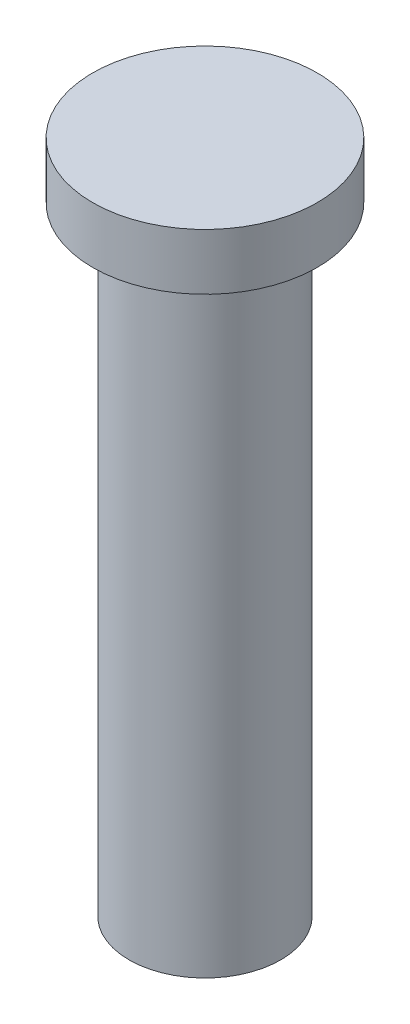
ISO-10303-21;
HEADER;
FILE_DESCRIPTION(('STEP AP214'),'2;1');
FILE_NAME('part.step','',(''),(''),'','','');
FILE_SCHEMA(('AUTOMOTIVE_DESIGN { 1 0 10303 214 1 1 1 1 }'));
ENDSEC;
DATA;
#1=APPLICATION_CONTEXT('core data for automotive mechanical design processes');
#2=APPLICATION_PROTOCOL_DEFINITION('international standard','automotive_design',2000,#1);
#3=PRODUCT_CONTEXT('',#1,'mechanical');
#4=PRODUCT('Part','Part','',(#3));
#5=PRODUCT_RELATED_PRODUCT_CATEGORY('part','',(#4));
#6=PRODUCT_DEFINITION_FORMATION('','',#4);
#7=PRODUCT_DEFINITION_CONTEXT('part definition',#1,'design');
#8=PRODUCT_DEFINITION('design','',#6,#7);
#9=PRODUCT_DEFINITION_SHAPE('','',#8);
#10=(LENGTH_UNIT() NAMED_UNIT(*) SI_UNIT(.MILLI.,.METRE.));
#11=(NAMED_UNIT(*) PLANE_ANGLE_UNIT() SI_UNIT($,.RADIAN.));
#12=(NAMED_UNIT(*) SI_UNIT($,.STERADIAN.) SOLID_ANGLE_UNIT());
#13=UNCERTAINTY_MEASURE_WITH_UNIT(LENGTH_MEASURE(1.E-05),#10,'distance_accuracy_value','');
#14=(GEOMETRIC_REPRESENTATION_CONTEXT(3) GLOBAL_UNCERTAINTY_ASSIGNED_CONTEXT((#13)) GLOBAL_UNIT_ASSIGNED_CONTEXT((#10,
#11,#12)) REPRESENTATION_CONTEXT('',''));
#15=CARTESIAN_POINT('',(0.,0.,0.));
#16=DIRECTION('',(0.,0.,1.));
#17=DIRECTION('',(1.,0.,0.));
#18=AXIS2_PLACEMENT_3D('',#15,#16,#17);
#19=CARTESIAN_POINT('',(0.,11.,0.));
#20=DIRECTION('',(0.,-1.,0.));
#21=DIRECTION('',(0.,0.,-1.));
#22=AXIS2_PLACEMENT_3D('',#19,#20,#21);
#23=CYLINDRICAL_SURFACE('',#22,1.35);
#24=CARTESIAN_POINT('',(0.,11.,0.));
#25=DIRECTION('',(0.,1.,0.));
#26=DIRECTION('',(0.,0.,1.));
#27=AXIS2_PLACEMENT_3D('',#24,#25,#26);
#28=CIRCLE('',#27,1.35);
#29=CARTESIAN_POINT('',(0.,11.,1.35));
#30=VERTEX_POINT('',#29);
#31=EDGE_CURVE('E10',#30,#30,#28,.T.);
#32=ORIENTED_EDGE('',*,*,#31,.F.);
#33=EDGE_LOOP('',(#32));
#34=FACE_BOUND('',#33,.T.);
#35=CARTESIAN_POINT('',(0.,0.,0.));
#36=DIRECTION('',(0.,1.,0.));
#37=DIRECTION('',(0.,0.,1.));
#38=AXIS2_PLACEMENT_3D('',#35,#36,#37);
#39=CIRCLE('',#38,1.35);
#40=CARTESIAN_POINT('',(0.,0.,1.35));
#41=VERTEX_POINT('',#40);
#42=EDGE_CURVE('E34',#41,#41,#39,.T.);
#43=ORIENTED_EDGE('',*,*,#42,.T.);
#44=EDGE_LOOP('',(#43));
#45=FACE_BOUND('',#44,.T.);
#46=ADVANCED_FACE('F31',(#34,#45),#23,.T.);
#47=CARTESIAN_POINT('',(0.,0.,0.));
#48=DIRECTION('',(0.,1.,0.));
#49=DIRECTION('',(0.,0.,1.));
#50=AXIS2_PLACEMENT_3D('',#47,#48,#49);
#51=PLANE('',#50);
#52=ORIENTED_EDGE('',*,*,#42,.F.);
#53=EDGE_LOOP('',(#52));
#54=FACE_BOUND('',#53,.T.);
#55=ADVANCED_FACE('F54',(#54),#51,.F.);
#56=CARTESIAN_POINT('',(0.,12.,0.));
#57=DIRECTION('',(0.,-1.,0.));
#58=DIRECTION('',(0.,0.,-1.));
#59=AXIS2_PLACEMENT_3D('',#56,#57,#58);
#60=CYLINDRICAL_SURFACE('',#59,2.);
#61=CARTESIAN_POINT('',(0.,12.,0.));
#62=DIRECTION('',(0.,1.,0.));
#63=DIRECTION('',(0.,0.,1.));
#64=AXIS2_PLACEMENT_3D('',#61,#62,#63);
#65=CIRCLE('',#64,2.);
#66=CARTESIAN_POINT('',(0.,12.,2.));
#67=VERTEX_POINT('',#66);
#68=EDGE_CURVE('E41',#67,#67,#65,.T.);
#69=ORIENTED_EDGE('',*,*,#68,.F.);
#70=EDGE_LOOP('',(#69));
#71=FACE_BOUND('',#70,.T.);
#72=CARTESIAN_POINT('',(0.,11.,0.));
#73=DIRECTION('',(0.,1.,0.));
#74=DIRECTION('',(0.,0.,1.));
#75=AXIS2_PLACEMENT_3D('',#72,#73,#74);
#76=CIRCLE('',#75,2.);
#77=CARTESIAN_POINT('',(0.,11.,2.));
#78=VERTEX_POINT('',#77);
#79=EDGE_CURVE('E43',#78,#78,#76,.T.);
#80=ORIENTED_EDGE('',*,*,#79,.T.);
#81=EDGE_LOOP('',(#80));
#82=FACE_BOUND('',#81,.T.);
#83=ADVANCED_FACE('F51',(#71,#82),#60,.T.);
#84=CARTESIAN_POINT('',(0.,12.,0.));
#85=DIRECTION('',(0.,1.,0.));
#86=DIRECTION('',(0.,0.,1.));
#87=AXIS2_PLACEMENT_3D('',#84,#85,#86);
#88=PLANE('',#87);
#89=ORIENTED_EDGE('',*,*,#68,.T.);
#90=EDGE_LOOP('',(#89));
#91=FACE_BOUND('',#90,.T.);
#92=ADVANCED_FACE('F49',(#91),#88,.T.);
#93=CARTESIAN_POINT('',(0.,11.,0.));
#94=DIRECTION('',(0.,1.,0.));
#95=DIRECTION('',(0.,0.,1.));
#96=AXIS2_PLACEMENT_3D('',#93,#94,#95);
#97=PLANE('',#96);
#98=ORIENTED_EDGE('',*,*,#31,.T.);
#99=EDGE_LOOP('',(#98));
#100=FACE_BOUND('',#99,.T.);
#101=ORIENTED_EDGE('',*,*,#79,.F.);
#102=EDGE_LOOP('',(#101));
#103=FACE_BOUND('',#102,.T.);
#104=ADVANCED_FACE('F58',(#100,#103),#97,.F.);
#105=CLOSED_SHELL('',(#46,#55,#83,#92,#104));
#106=MANIFOLD_SOLID_BREP('B2',#105);
#107=ADVANCED_BREP_SHAPE_REPRESENTATION('',(#18,#106),#14);
#108=SHAPE_DEFINITION_REPRESENTATION(#9,#107);
ENDSEC;
END-ISO-10303-21;
